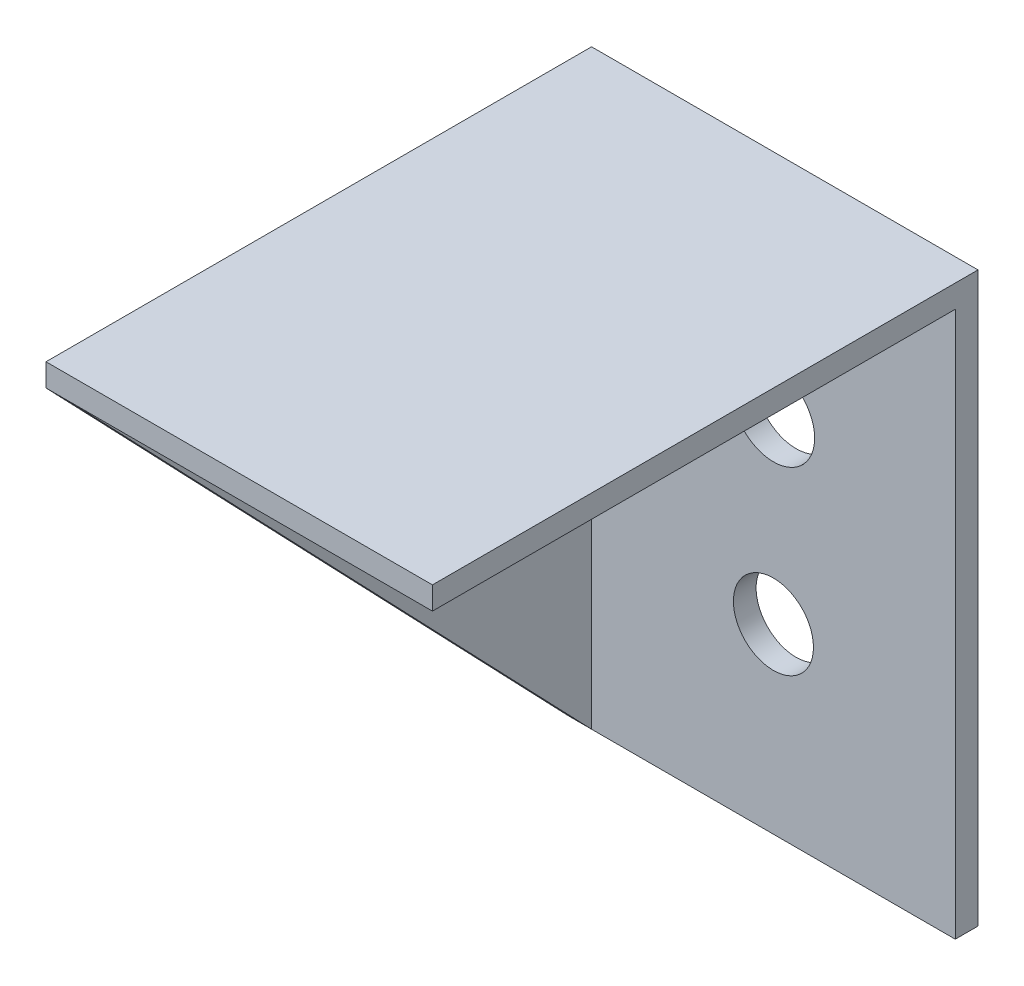
ISO-10303-21;
HEADER;
FILE_DESCRIPTION(('STEP AP214'),'2;1');
FILE_NAME('part.step','',(''),(''),'','','');
FILE_SCHEMA(('AUTOMOTIVE_DESIGN { 1 0 10303 214 1 1 1 1 }'));
ENDSEC;
DATA;
#1=APPLICATION_CONTEXT('core data for automotive mechanical design processes');
#2=APPLICATION_PROTOCOL_DEFINITION('international standard','automotive_design',2000,#1);
#3=PRODUCT_CONTEXT('',#1,'mechanical');
#4=PRODUCT('Part','Part','',(#3));
#5=PRODUCT_RELATED_PRODUCT_CATEGORY('part','',(#4));
#6=PRODUCT_DEFINITION_FORMATION('','',#4);
#7=PRODUCT_DEFINITION_CONTEXT('part definition',#1,'design');
#8=PRODUCT_DEFINITION('design','',#6,#7);
#9=PRODUCT_DEFINITION_SHAPE('','',#8);
#10=(LENGTH_UNIT() NAMED_UNIT(*) SI_UNIT(.MILLI.,.METRE.));
#11=(NAMED_UNIT(*) PLANE_ANGLE_UNIT() SI_UNIT($,.RADIAN.));
#12=(NAMED_UNIT(*) SI_UNIT($,.STERADIAN.) SOLID_ANGLE_UNIT());
#13=UNCERTAINTY_MEASURE_WITH_UNIT(LENGTH_MEASURE(1.E-05),#10,'distance_accuracy_value','');
#14=(GEOMETRIC_REPRESENTATION_CONTEXT(3) GLOBAL_UNCERTAINTY_ASSIGNED_CONTEXT((#13)) GLOBAL_UNIT_ASSIGNED_CONTEXT((#10,
#11,#12)) REPRESENTATION_CONTEXT('',''));
#15=CARTESIAN_POINT('',(0.,0.,0.));
#16=DIRECTION('',(0.,0.,1.));
#17=DIRECTION('',(1.,0.,0.));
#18=AXIS2_PLACEMENT_3D('',#15,#16,#17);
#19=CARTESIAN_POINT('',(0.146853146853148,2.92657342657343,0.125));
#20=DIRECTION('',(-1.,0.,0.));
#21=DIRECTION('',(0.,0.,1.));
#22=AXIS2_PLACEMENT_3D('',#19,#20,#21);
#23=PLANE('',#22);
#24=DIRECTION('',(0.,1.,0.));
#25=VECTOR('',#24,1.);
#26=CARTESIAN_POINT('',(0.146853146853148,2.92657342657343,0.));
#27=LINE('',#26,#25);
#28=CARTESIAN_POINT('',(0.146853146853148,-0.0734265734265735,0.));
#29=VERTEX_POINT('',#28);
#30=CARTESIAN_POINT('',(0.146853146853147,3.05157342657343,0.));
#31=VERTEX_POINT('',#30);
#32=EDGE_CURVE('E147',#29,#31,#27,.T.);
#33=ORIENTED_EDGE('',*,*,#32,.T.);
#34=DIRECTION('',(0.,0.,-1.));
#35=VECTOR('',#34,1.);
#36=CARTESIAN_POINT('',(0.146853146853147,3.05157342657343,0.));
#37=LINE('',#36,#35);
#38=CARTESIAN_POINT('',(0.146853146853148,3.05157342657343,3.));
#39=VERTEX_POINT('',#38);
#40=EDGE_CURVE('E97',#39,#31,#37,.T.);
#41=ORIENTED_EDGE('',*,*,#40,.F.);
#42=DIRECTION('',(0.,-1.,0.));
#43=VECTOR('',#42,1.);
#44=CARTESIAN_POINT('',(0.146853146853148,3.05157342657343,3.));
#45=LINE('',#44,#43);
#46=CARTESIAN_POINT('',(0.146853146853148,2.92657342657343,3.));
#47=VERTEX_POINT('',#46);
#48=EDGE_CURVE('E100',#39,#47,#45,.T.);
#49=ORIENTED_EDGE('',*,*,#48,.T.);
#50=DIRECTION('',(0.,0.,-1.));
#51=VECTOR('',#50,1.);
#52=CARTESIAN_POINT('',(0.146853146853147,2.92657342657343,0.));
#53=LINE('',#52,#51);
#54=CARTESIAN_POINT('',(0.146853146853147,2.92657342657343,0.125));
#55=VERTEX_POINT('',#54);
#56=EDGE_CURVE('E137',#47,#55,#53,.T.);
#57=ORIENTED_EDGE('',*,*,#56,.T.);
#58=DIRECTION('',(0.,1.,0.));
#59=VECTOR('',#58,1.);
#60=CARTESIAN_POINT('',(0.146853146853148,2.92657342657343,0.125));
#61=LINE('',#60,#59);
#62=CARTESIAN_POINT('',(0.146853146853148,-0.0734265734265735,0.125));
#63=VERTEX_POINT('',#62);
#64=EDGE_CURVE('E148',#63,#55,#61,.T.);
#65=ORIENTED_EDGE('',*,*,#64,.F.);
#66=DIRECTION('',(0.,0.,-1.));
#67=VECTOR('',#66,1.);
#68=CARTESIAN_POINT('',(0.146853146853148,-0.0734265734265735,0.125));
#69=LINE('',#68,#67);
#70=EDGE_CURVE('E11',#63,#29,#69,.T.);
#71=ORIENTED_EDGE('',*,*,#70,.T.);
#72=EDGE_LOOP('',(#33,#41,#49,#57,#65,#71));
#73=FACE_BOUND('',#72,.T.);
#74=ADVANCED_FACE('F37',(#73),#23,.F.);
#75=CARTESIAN_POINT('',(-1.85314685314685,-0.0734265734265735,0.125));
#76=DIRECTION('',(0.,1.,0.));
#77=DIRECTION('',(0.,0.,1.));
#78=AXIS2_PLACEMENT_3D('',#75,#76,#77);
#79=PLANE('',#78);
#80=DIRECTION('',(1.,0.,0.));
#81=VECTOR('',#80,1.);
#82=CARTESIAN_POINT('',(-1.85314685314685,-0.0734265734265735,0.));
#83=LINE('',#82,#81);
#84=CARTESIAN_POINT('',(-1.97814685314685,-0.0734265734265735,0.));
#85=VERTEX_POINT('',#84);
#86=EDGE_CURVE('E106',#85,#29,#83,.T.);
#87=ORIENTED_EDGE('',*,*,#86,.T.);
#88=ORIENTED_EDGE('',*,*,#70,.F.);
#89=DIRECTION('',(1.,0.,0.));
#90=VECTOR('',#89,1.);
#91=CARTESIAN_POINT('',(-1.85314685314685,-0.0734265734265735,0.125));
#92=LINE('',#91,#90);
#93=CARTESIAN_POINT('',(-1.85314685314685,-0.0734265734265735,0.125));
#94=VERTEX_POINT('',#93);
#95=EDGE_CURVE('E45',#94,#63,#92,.T.);
#96=ORIENTED_EDGE('',*,*,#95,.F.);
#97=DIRECTION('',(1.,0.,0.));
#98=VECTOR('',#97,1.);
#99=CARTESIAN_POINT('',(-1.97814685314685,-0.0734265734265735,0.125));
#100=LINE('',#99,#98);
#101=CARTESIAN_POINT('',(-1.97814685314685,-0.0734265734265735,0.125));
#102=VERTEX_POINT('',#101);
#103=EDGE_CURVE('E131',#102,#94,#100,.T.);
#104=ORIENTED_EDGE('',*,*,#103,.F.);
#105=DIRECTION('',(0.,0.,1.));
#106=VECTOR('',#105,1.);
#107=CARTESIAN_POINT('',(-1.97814685314685,-0.0734265734265735,0.));
#108=LINE('',#107,#106);
#109=EDGE_CURVE('E109',#85,#102,#108,.T.);
#110=ORIENTED_EDGE('',*,*,#109,.F.);
#111=EDGE_LOOP('',(#87,#88,#96,#104,#110));
#112=FACE_BOUND('',#111,.T.);
#113=ADVANCED_FACE('F157',(#112),#79,.F.);
#114=CARTESIAN_POINT('',(0.,0.,0.125));
#115=DIRECTION('',(0.,0.,1.));
#116=DIRECTION('',(1.,0.,0.));
#117=AXIS2_PLACEMENT_3D('',#114,#115,#116);
#118=PLANE('',#117);
#119=CARTESIAN_POINT('',(-0.853146853146853,1.92657342657343,0.125));
#120=DIRECTION('',(0.,0.,1.));
#121=DIRECTION('',(1.,0.,0.));
#122=AXIS2_PLACEMENT_3D('',#119,#120,#121);
#123=CIRCLE('',#122,0.22668200491192);
#124=CARTESIAN_POINT('',(-0.626464848234932,1.92657342657343,0.125));
#125=VERTEX_POINT('',#124);
#126=EDGE_CURVE('E277',#125,#125,#123,.T.);
#127=ORIENTED_EDGE('',*,*,#126,.F.);
#128=EDGE_LOOP('',(#127));
#129=FACE_BOUND('',#128,.T.);
#130=CARTESIAN_POINT('',(-0.853146853146853,0.926573426573426,0.125));
#131=DIRECTION('',(0.,0.,1.));
#132=DIRECTION('',(1.,0.,0.));
#133=AXIS2_PLACEMENT_3D('',#130,#131,#132);
#134=CIRCLE('',#133,0.220108329528288);
#135=CARTESIAN_POINT('',(-0.633038523618565,0.926573426573426,0.125));
#136=VERTEX_POINT('',#135);
#137=EDGE_CURVE('E121',#136,#136,#134,.T.);
#138=ORIENTED_EDGE('',*,*,#137,.F.);
#139=EDGE_LOOP('',(#138));
#140=FACE_BOUND('',#139,.T.);
#141=ORIENTED_EDGE('',*,*,#64,.T.);
#142=DIRECTION('',(-1.,0.,0.));
#143=VECTOR('',#142,1.);
#144=CARTESIAN_POINT('',(-1.85314685314685,2.92657342657343,0.125));
#145=LINE('',#144,#143);
#146=CARTESIAN_POINT('',(-1.85314685314685,2.92657342657343,0.125));
#147=VERTEX_POINT('',#146);
#148=EDGE_CURVE('E150',#55,#147,#145,.T.);
#149=ORIENTED_EDGE('',*,*,#148,.T.);
#150=DIRECTION('',(0.,-1.,0.));
#151=VECTOR('',#150,1.);
#152=CARTESIAN_POINT('',(-1.85314685314685,2.92657342657343,0.125));
#153=LINE('',#152,#151);
#154=EDGE_CURVE('E153',#147,#94,#153,.T.);
#155=ORIENTED_EDGE('',*,*,#154,.T.);
#156=ORIENTED_EDGE('',*,*,#95,.T.);
#157=EDGE_LOOP('',(#141,#149,#155,#156));
#158=FACE_BOUND('',#157,.T.);
#159=ADVANCED_FACE('F162',(#129,#140,#158),#118,.T.);
#160=CARTESIAN_POINT('',(0.,0.,0.));
#161=DIRECTION('',(0.,0.,1.));
#162=DIRECTION('',(1.,0.,0.));
#163=AXIS2_PLACEMENT_3D('',#160,#161,#162);
#164=PLANE('',#163);
#165=CARTESIAN_POINT('',(-0.853146853146853,1.92657342657343,0.));
#166=DIRECTION('',(0.,0.,1.));
#167=DIRECTION('',(1.,0.,0.));
#168=AXIS2_PLACEMENT_3D('',#165,#166,#167);
#169=CIRCLE('',#168,0.22668200491192);
#170=CARTESIAN_POINT('',(-0.626464848234932,1.92657342657343,0.));
#171=VERTEX_POINT('',#170);
#172=EDGE_CURVE('E274',#171,#171,#169,.T.);
#173=ORIENTED_EDGE('',*,*,#172,.T.);
#174=EDGE_LOOP('',(#173));
#175=FACE_BOUND('',#174,.T.);
#176=CARTESIAN_POINT('',(-0.853146853146853,0.926573426573426,0.));
#177=DIRECTION('',(0.,0.,1.));
#178=DIRECTION('',(1.,0.,0.));
#179=AXIS2_PLACEMENT_3D('',#176,#177,#178);
#180=CIRCLE('',#179,0.220108329528288);
#181=CARTESIAN_POINT('',(-0.633038523618565,0.926573426573426,0.));
#182=VERTEX_POINT('',#181);
#183=EDGE_CURVE('E118',#182,#182,#180,.T.);
#184=ORIENTED_EDGE('',*,*,#183,.T.);
#185=EDGE_LOOP('',(#184));
#186=FACE_BOUND('',#185,.T.);
#187=ORIENTED_EDGE('',*,*,#32,.F.);
#188=ORIENTED_EDGE('',*,*,#86,.F.);
#189=DIRECTION('',(0.,-1.,0.));
#190=VECTOR('',#189,1.);
#191=CARTESIAN_POINT('',(-1.97814685314685,3.05157342657343,0.));
#192=LINE('',#191,#190);
#193=CARTESIAN_POINT('',(-1.97814685314685,3.05157342657343,0.));
#194=VERTEX_POINT('',#193);
#195=EDGE_CURVE('E103',#194,#85,#192,.T.);
#196=ORIENTED_EDGE('',*,*,#195,.F.);
#197=DIRECTION('',(-1.,0.,0.));
#198=VECTOR('',#197,1.);
#199=CARTESIAN_POINT('',(-1.85314685314685,3.05157342657343,0.));
#200=LINE('',#199,#198);
#201=EDGE_CURVE('E91',#31,#194,#200,.T.);
#202=ORIENTED_EDGE('',*,*,#201,.F.);
#203=EDGE_LOOP('',(#187,#188,#196,#202));
#204=FACE_BOUND('',#203,.T.);
#205=ADVANCED_FACE('F104',(#175,#186,#204),#164,.F.);
#206=CARTESIAN_POINT('',(-1.85314685314685,3.05157342657343,3.));
#207=DIRECTION('',(0.,0.,-1.));
#208=DIRECTION('',(-1.,0.,0.));
#209=AXIS2_PLACEMENT_3D('',#206,#207,#208);
#210=PLANE('',#209);
#211=DIRECTION('',(1.,0.,0.));
#212=VECTOR('',#211,1.);
#213=CARTESIAN_POINT('',(-1.85314685314685,2.92657342657343,3.));
#214=LINE('',#213,#212);
#215=CARTESIAN_POINT('',(-1.85314685314685,2.92657342657343,3.));
#216=VERTEX_POINT('',#215);
#217=EDGE_CURVE('E141',#216,#47,#214,.T.);
#218=ORIENTED_EDGE('',*,*,#217,.T.);
#219=ORIENTED_EDGE('',*,*,#48,.F.);
#220=DIRECTION('',(1.,0.,0.));
#221=VECTOR('',#220,1.);
#222=CARTESIAN_POINT('',(-1.85314685314685,3.05157342657343,3.));
#223=LINE('',#222,#221);
#224=CARTESIAN_POINT('',(-1.97814685314685,3.05157342657343,3.));
#225=VERTEX_POINT('',#224);
#226=EDGE_CURVE('E135',#225,#39,#223,.T.);
#227=ORIENTED_EDGE('',*,*,#226,.F.);
#228=DIRECTION('',(0.,1.,0.));
#229=VECTOR('',#228,1.);
#230=CARTESIAN_POINT('',(-1.97814685314685,2.92657342657343,3.));
#231=LINE('',#230,#229);
#232=CARTESIAN_POINT('',(-1.97814685314685,2.92657342657343,3.));
#233=VERTEX_POINT('',#232);
#234=EDGE_CURVE('E114',#233,#225,#231,.T.);
#235=ORIENTED_EDGE('',*,*,#234,.F.);
#236=DIRECTION('',(1.,0.,0.));
#237=VECTOR('',#236,1.);
#238=CARTESIAN_POINT('',(-1.97814685314685,2.92657342657343,3.));
#239=LINE('',#238,#237);
#240=EDGE_CURVE('E127',#233,#216,#239,.T.);
#241=ORIENTED_EDGE('',*,*,#240,.T.);
#242=EDGE_LOOP('',(#218,#219,#227,#235,#241));
#243=FACE_BOUND('',#242,.T.);
#244=ADVANCED_FACE('F173',(#243),#210,.F.);
#245=CARTESIAN_POINT('',(0.,3.05157342657343,0.));
#246=DIRECTION('',(0.,1.,0.));
#247=DIRECTION('',(0.,0.,1.));
#248=AXIS2_PLACEMENT_3D('',#245,#246,#247);
#249=PLANE('',#248);
#250=ORIENTED_EDGE('',*,*,#201,.T.);
#251=DIRECTION('',(0.,0.,-1.));
#252=VECTOR('',#251,1.);
#253=CARTESIAN_POINT('',(-1.97814685314685,3.05157342657343,3.));
#254=LINE('',#253,#252);
#255=EDGE_CURVE('E95',#225,#194,#254,.T.);
#256=ORIENTED_EDGE('',*,*,#255,.F.);
#257=ORIENTED_EDGE('',*,*,#226,.T.);
#258=ORIENTED_EDGE('',*,*,#40,.T.);
#259=EDGE_LOOP('',(#250,#256,#257,#258));
#260=FACE_BOUND('',#259,.T.);
#261=ADVANCED_FACE('F93',(#260),#249,.T.);
#262=CARTESIAN_POINT('',(0.,2.92657342657343,0.));
#263=DIRECTION('',(0.,1.,0.));
#264=DIRECTION('',(0.,0.,1.));
#265=AXIS2_PLACEMENT_3D('',#262,#263,#264);
#266=PLANE('',#265);
#267=ORIENTED_EDGE('',*,*,#148,.F.);
#268=ORIENTED_EDGE('',*,*,#56,.F.);
#269=ORIENTED_EDGE('',*,*,#217,.F.);
#270=DIRECTION('',(0.,0.,1.));
#271=VECTOR('',#270,1.);
#272=CARTESIAN_POINT('',(-1.85314685314685,2.92657342657343,0.));
#273=LINE('',#272,#271);
#274=EDGE_CURVE('E134',#147,#216,#273,.T.);
#275=ORIENTED_EDGE('',*,*,#274,.F.);
#276=EDGE_LOOP('',(#267,#268,#269,#275));
#277=FACE_BOUND('',#276,.T.);
#278=ADVANCED_FACE('F175',(#277),#266,.F.);
#279=CARTESIAN_POINT('',(-1.97814685314685,-0.0734265734265735,0.125));
#280=DIRECTION('',(0.,0.691905363235615,-0.721988205115424));
#281=DIRECTION('',(0.,0.721988205115424,0.691905363235615));
#282=AXIS2_PLACEMENT_3D('',#279,#280,#281);
#283=PLANE('',#282);
#284=DIRECTION('',(0.,0.721988205115424,0.691905363235615));
#285=VECTOR('',#284,1.);
#286=CARTESIAN_POINT('',(-1.85314685314685,-0.0734265734265735,0.125));
#287=LINE('',#286,#285);
#288=EDGE_CURVE('E115',#94,#216,#287,.T.);
#289=ORIENTED_EDGE('',*,*,#288,.T.);
#290=ORIENTED_EDGE('',*,*,#240,.F.);
#291=DIRECTION('',(0.,0.721988205115424,0.691905363235615));
#292=VECTOR('',#291,1.);
#293=CARTESIAN_POINT('',(-1.97814685314685,-0.0734265734265735,0.125));
#294=LINE('',#293,#292);
#295=EDGE_CURVE('E125',#102,#233,#294,.T.);
#296=ORIENTED_EDGE('',*,*,#295,.F.);
#297=ORIENTED_EDGE('',*,*,#103,.T.);
#298=EDGE_LOOP('',(#289,#290,#296,#297));
#299=FACE_BOUND('',#298,.T.);
#300=ADVANCED_FACE('F170',(#299),#283,.F.);
#301=CARTESIAN_POINT('',(-1.97814685314685,0.,0.));
#302=DIRECTION('',(-1.,0.,0.));
#303=DIRECTION('',(0.,-1.,0.));
#304=AXIS2_PLACEMENT_3D('',#301,#302,#303);
#305=PLANE('',#304);
#306=ORIENTED_EDGE('',*,*,#255,.T.);
#307=ORIENTED_EDGE('',*,*,#195,.T.);
#308=ORIENTED_EDGE('',*,*,#109,.T.);
#309=ORIENTED_EDGE('',*,*,#295,.T.);
#310=ORIENTED_EDGE('',*,*,#234,.T.);
#311=EDGE_LOOP('',(#306,#307,#308,#309,#310));
#312=FACE_BOUND('',#311,.T.);
#313=ADVANCED_FACE('F112',(#312),#305,.T.);
#314=CARTESIAN_POINT('',(-1.85314685314685,0.,0.));
#315=DIRECTION('',(-1.,0.,0.));
#316=DIRECTION('',(0.,-1.,0.));
#317=AXIS2_PLACEMENT_3D('',#314,#315,#316);
#318=PLANE('',#317);
#319=ORIENTED_EDGE('',*,*,#154,.F.);
#320=ORIENTED_EDGE('',*,*,#274,.T.);
#321=ORIENTED_EDGE('',*,*,#288,.F.);
#322=EDGE_LOOP('',(#319,#320,#321));
#323=FACE_BOUND('',#322,.T.);
#324=ADVANCED_FACE('F167',(#323),#318,.F.);
#325=CARTESIAN_POINT('',(-0.853146853146853,0.926573426573426,0.));
#326=DIRECTION('',(0.,0.,1.));
#327=DIRECTION('',(1.,0.,0.));
#328=AXIS2_PLACEMENT_3D('',#325,#326,#327);
#329=CYLINDRICAL_SURFACE('',#328,0.220108329528288);
#330=ORIENTED_EDGE('',*,*,#183,.F.);
#331=EDGE_LOOP('',(#330));
#332=FACE_BOUND('',#331,.T.);
#333=ORIENTED_EDGE('',*,*,#137,.T.);
#334=EDGE_LOOP('',(#333));
#335=FACE_BOUND('',#334,.T.);
#336=ADVANCED_FACE('F235',(#332,#335),#329,.F.);
#337=CARTESIAN_POINT('',(-0.853146853146853,1.92657342657343,0.));
#338=DIRECTION('',(0.,0.,1.));
#339=DIRECTION('',(1.,0.,0.));
#340=AXIS2_PLACEMENT_3D('',#337,#338,#339);
#341=CYLINDRICAL_SURFACE('',#340,0.22668200491192);
#342=ORIENTED_EDGE('',*,*,#172,.F.);
#343=EDGE_LOOP('',(#342));
#344=FACE_BOUND('',#343,.T.);
#345=ORIENTED_EDGE('',*,*,#126,.T.);
#346=EDGE_LOOP('',(#345));
#347=FACE_BOUND('',#346,.T.);
#348=ADVANCED_FACE('F257',(#344,#347),#341,.F.);
#349=CLOSED_SHELL('',(#74,#113,#159,#205,#244,#261,#278,#300,#313,#324,#336,#348));
#350=MANIFOLD_SOLID_BREP('B2',#349);
#351=ADVANCED_BREP_SHAPE_REPRESENTATION('',(#18,#350),#14);
#352=SHAPE_DEFINITION_REPRESENTATION(#9,#351);
ENDSEC;
END-ISO-10303-21;
